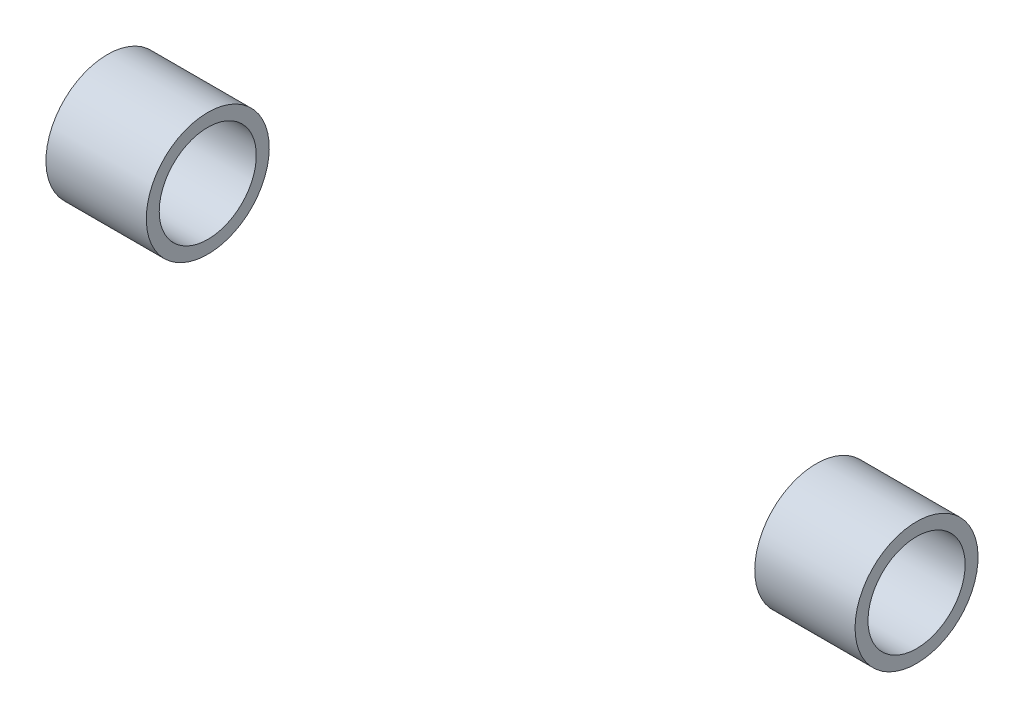
ISO-10303-21;
HEADER;
FILE_DESCRIPTION(('STEP AP214'),'2;1');
FILE_NAME('part.step','',(''),(''),'','','');
FILE_SCHEMA(('AUTOMOTIVE_DESIGN { 1 0 10303 214 1 1 1 1 }'));
ENDSEC;
DATA;
#1=APPLICATION_CONTEXT('core data for automotive mechanical design processes');
#2=APPLICATION_PROTOCOL_DEFINITION('international standard','automotive_design',2000,#1);
#3=PRODUCT_CONTEXT('',#1,'mechanical');
#4=PRODUCT('Part','Part','',(#3));
#5=PRODUCT_RELATED_PRODUCT_CATEGORY('part','',(#4));
#6=PRODUCT_DEFINITION_FORMATION('','',#4);
#7=PRODUCT_DEFINITION_CONTEXT('part definition',#1,'design');
#8=PRODUCT_DEFINITION('design','',#6,#7);
#9=PRODUCT_DEFINITION_SHAPE('','',#8);
#10=(LENGTH_UNIT() NAMED_UNIT(*) SI_UNIT(.MILLI.,.METRE.));
#11=(NAMED_UNIT(*) PLANE_ANGLE_UNIT() SI_UNIT($,.RADIAN.));
#12=(NAMED_UNIT(*) SI_UNIT($,.STERADIAN.) SOLID_ANGLE_UNIT());
#13=UNCERTAINTY_MEASURE_WITH_UNIT(LENGTH_MEASURE(1.E-05),#10,'distance_accuracy_value','');
#14=(GEOMETRIC_REPRESENTATION_CONTEXT(3) GLOBAL_UNCERTAINTY_ASSIGNED_CONTEXT((#13)) GLOBAL_UNIT_ASSIGNED_CONTEXT((#10,
#11,#12)) REPRESENTATION_CONTEXT('',''));
#15=CARTESIAN_POINT('',(0.,0.,0.));
#16=DIRECTION('',(0.,0.,1.));
#17=DIRECTION('',(1.,0.,0.));
#18=AXIS2_PLACEMENT_3D('',#15,#16,#17);
#19=CARTESIAN_POINT('',(12.5,-30.,81.));
#20=DIRECTION('',(-1.,0.,0.));
#21=DIRECTION('',(0.,0.746654905866277,-0.66521158404362));
#22=AXIS2_PLACEMENT_3D('',#19,#20,#21);
#23=CYLINDRICAL_SURFACE('',#22,1.5);
#24=CARTESIAN_POINT('',(9.4,-30.,81.));
#25=DIRECTION('',(1.,0.,0.));
#26=DIRECTION('',(0.,0.,-1.));
#27=AXIS2_PLACEMENT_3D('',#24,#25,#26);
#28=CIRCLE('',#27,1.50000000000008);
#29=CARTESIAN_POINT('',(9.4,-30.,79.4999999999999));
#30=VERTEX_POINT('',#29);
#31=EDGE_CURVE('E57',#30,#30,#28,.T.);
#32=ORIENTED_EDGE('',*,*,#31,.F.);
#33=EDGE_LOOP('',(#32));
#34=FACE_BOUND('',#33,.T.);
#35=CARTESIAN_POINT('',(12.5,-30.,81.));
#36=DIRECTION('',(1.,0.,0.));
#37=DIRECTION('',(0.,-0.746654905866277,0.66521158404362));
#38=AXIS2_PLACEMENT_3D('',#35,#36,#37);
#39=CIRCLE('',#38,1.5);
#40=CARTESIAN_POINT('',(12.5,-31.1199823587994,81.9978173760655));
#41=VERTEX_POINT('',#40);
#42=EDGE_CURVE('E78',#41,#41,#39,.T.);
#43=ORIENTED_EDGE('',*,*,#42,.T.);
#44=EDGE_LOOP('',(#43));
#45=FACE_BOUND('',#44,.T.);
#46=ADVANCED_FACE('F53',(#34,#45),#23,.F.);
#47=CARTESIAN_POINT('',(12.5,-30.,81.));
#48=DIRECTION('',(1.,0.,0.));
#49=DIRECTION('',(0.,0.,-1.));
#50=AXIS2_PLACEMENT_3D('',#47,#48,#49);
#51=PLANE('',#50);
#52=ORIENTED_EDGE('',*,*,#42,.F.);
#53=EDGE_LOOP('',(#52));
#54=FACE_BOUND('',#53,.T.);
#55=CARTESIAN_POINT('',(12.5,-30.,81.));
#56=DIRECTION('',(1.,0.,0.));
#57=DIRECTION('',(0.,-0.746654905866276,0.66521158404362));
#58=AXIS2_PLACEMENT_3D('',#55,#56,#57);
#59=CIRCLE('',#58,1.9);
#60=CARTESIAN_POINT('',(12.5,-31.4186443211459,82.2639020096829));
#61=VERTEX_POINT('',#60);
#62=EDGE_CURVE('E84',#61,#61,#59,.T.);
#63=ORIENTED_EDGE('',*,*,#62,.T.);
#64=EDGE_LOOP('',(#63));
#65=FACE_BOUND('',#64,.T.);
#66=ADVANCED_FACE('F55',(#54,#65),#51,.T.);
#67=CARTESIAN_POINT('',(9.4,-30.,81.));
#68=DIRECTION('',(1.,0.,0.));
#69=DIRECTION('',(0.,0.,-1.));
#70=AXIS2_PLACEMENT_3D('',#67,#68,#69);
#71=PLANE('',#70);
#72=ORIENTED_EDGE('',*,*,#31,.T.);
#73=EDGE_LOOP('',(#72));
#74=FACE_BOUND('',#73,.T.);
#75=CARTESIAN_POINT('',(9.4,-30.,81.));
#76=DIRECTION('',(1.,0.,0.));
#77=DIRECTION('',(0.,-0.746654905866276,0.66521158404362));
#78=AXIS2_PLACEMENT_3D('',#75,#76,#77);
#79=CIRCLE('',#78,1.9);
#80=CARTESIAN_POINT('',(9.4,-31.4186443211459,82.2639020096829));
#81=VERTEX_POINT('',#80);
#82=EDGE_CURVE('E12',#81,#81,#79,.T.);
#83=ORIENTED_EDGE('',*,*,#82,.F.);
#84=EDGE_LOOP('',(#83));
#85=FACE_BOUND('',#84,.T.);
#86=ADVANCED_FACE('F95',(#74,#85),#71,.F.);
#87=CARTESIAN_POINT('',(9.4,-30.,81.));
#88=DIRECTION('',(1.,0.,0.));
#89=DIRECTION('',(0.,-0.746654905866276,0.66521158404362));
#90=AXIS2_PLACEMENT_3D('',#87,#88,#89);
#91=CYLINDRICAL_SURFACE('',#90,1.9);
#92=ORIENTED_EDGE('',*,*,#82,.T.);
#93=EDGE_LOOP('',(#92));
#94=FACE_BOUND('',#93,.T.);
#95=ORIENTED_EDGE('',*,*,#62,.F.);
#96=EDGE_LOOP('',(#95));
#97=FACE_BOUND('',#96,.T.);
#98=ADVANCED_FACE('F106',(#94,#97),#91,.T.);
#99=CLOSED_SHELL('',(#46,#66,#86,#98));
#100=MANIFOLD_SOLID_BREP('B2',#99);
#101=CARTESIAN_POINT('',(-9.4,-30.,81.));
#102=DIRECTION('',(-1.,0.,0.));
#103=DIRECTION('',(0.,0.746654905866276,-0.66521158404362));
#104=AXIS2_PLACEMENT_3D('',#101,#102,#103);
#105=CYLINDRICAL_SURFACE('',#104,1.9);
#106=CARTESIAN_POINT('',(-9.4,-30.,81.));
#107=DIRECTION('',(-1.,0.,0.));
#108=DIRECTION('',(0.,0.746654905866276,-0.66521158404362));
#109=AXIS2_PLACEMENT_3D('',#106,#107,#108);
#110=CIRCLE('',#109,1.9);
#111=CARTESIAN_POINT('',(-9.4,-28.581355678854,79.7360979903172));
#112=VERTEX_POINT('',#111);
#113=EDGE_CURVE('E51',#112,#112,#110,.T.);
#114=ORIENTED_EDGE('',*,*,#113,.T.);
#115=EDGE_LOOP('',(#114));
#116=FACE_BOUND('',#115,.T.);
#117=CARTESIAN_POINT('',(-12.5,-30.,81.));
#118=DIRECTION('',(-1.,0.,0.));
#119=DIRECTION('',(0.,0.746654905866276,-0.66521158404362));
#120=AXIS2_PLACEMENT_3D('',#117,#118,#119);
#121=CIRCLE('',#120,1.9);
#122=CARTESIAN_POINT('',(-12.5,-28.581355678854,79.7360979903172));
#123=VERTEX_POINT('',#122);
#124=EDGE_CURVE('E148',#123,#123,#121,.T.);
#125=ORIENTED_EDGE('',*,*,#124,.F.);
#126=EDGE_LOOP('',(#125));
#127=FACE_BOUND('',#126,.T.);
#128=ADVANCED_FACE('F144',(#116,#127),#105,.T.);
#129=CARTESIAN_POINT('',(-9.4,-30.,81.));
#130=DIRECTION('',(-1.,0.,0.));
#131=DIRECTION('',(0.,0.,1.));
#132=AXIS2_PLACEMENT_3D('',#129,#130,#131);
#133=PLANE('',#132);
#134=CARTESIAN_POINT('',(-9.4,-30.,81.));
#135=DIRECTION('',(-1.,0.,0.));
#136=DIRECTION('',(0.,0.,1.));
#137=AXIS2_PLACEMENT_3D('',#134,#135,#136);
#138=CIRCLE('',#137,1.50000000000008);
#139=CARTESIAN_POINT('',(-9.4,-30.,82.5000000000001));
#140=VERTEX_POINT('',#139);
#141=EDGE_CURVE('E169',#140,#140,#138,.T.);
#142=ORIENTED_EDGE('',*,*,#141,.T.);
#143=EDGE_LOOP('',(#142));
#144=FACE_BOUND('',#143,.T.);
#145=ORIENTED_EDGE('',*,*,#113,.F.);
#146=EDGE_LOOP('',(#145));
#147=FACE_BOUND('',#146,.T.);
#148=ADVANCED_FACE('F179',(#144,#147),#133,.F.);
#149=CARTESIAN_POINT('',(-12.5,-30.,81.));
#150=DIRECTION('',(-1.,0.,0.));
#151=DIRECTION('',(0.,0.,1.));
#152=AXIS2_PLACEMENT_3D('',#149,#150,#151);
#153=PLANE('',#152);
#154=CARTESIAN_POINT('',(-12.5,-30.,81.));
#155=DIRECTION('',(-1.,0.,0.));
#156=DIRECTION('',(0.,0.746654905866277,-0.66521158404362));
#157=AXIS2_PLACEMENT_3D('',#154,#155,#156);
#158=CIRCLE('',#157,1.5);
#159=CARTESIAN_POINT('',(-12.5,-28.8800176412006,80.0021826239346));
#160=VERTEX_POINT('',#159);
#161=EDGE_CURVE('E155',#160,#160,#158,.T.);
#162=ORIENTED_EDGE('',*,*,#161,.F.);
#163=EDGE_LOOP('',(#162));
#164=FACE_BOUND('',#163,.T.);
#165=ORIENTED_EDGE('',*,*,#124,.T.);
#166=EDGE_LOOP('',(#165));
#167=FACE_BOUND('',#166,.T.);
#168=ADVANCED_FACE('F166',(#164,#167),#153,.T.);
#169=CARTESIAN_POINT('',(-12.5,-30.,81.));
#170=DIRECTION('',(1.,0.,0.));
#171=DIRECTION('',(0.,-0.746654905866277,0.66521158404362));
#172=AXIS2_PLACEMENT_3D('',#169,#170,#171);
#173=CYLINDRICAL_SURFACE('',#172,1.5);
#174=ORIENTED_EDGE('',*,*,#161,.T.);
#175=EDGE_LOOP('',(#174));
#176=FACE_BOUND('',#175,.T.);
#177=ORIENTED_EDGE('',*,*,#141,.F.);
#178=EDGE_LOOP('',(#177));
#179=FACE_BOUND('',#178,.T.);
#180=ADVANCED_FACE('F146',(#176,#179),#173,.F.);
#181=CLOSED_SHELL('',(#128,#148,#168,#180));
#182=MANIFOLD_SOLID_BREP('B6',#181);
#183=ADVANCED_BREP_SHAPE_REPRESENTATION('',(#18,#100,#182),#14);
#184=SHAPE_DEFINITION_REPRESENTATION(#9,#183);
ENDSEC;
END-ISO-10303-21;
